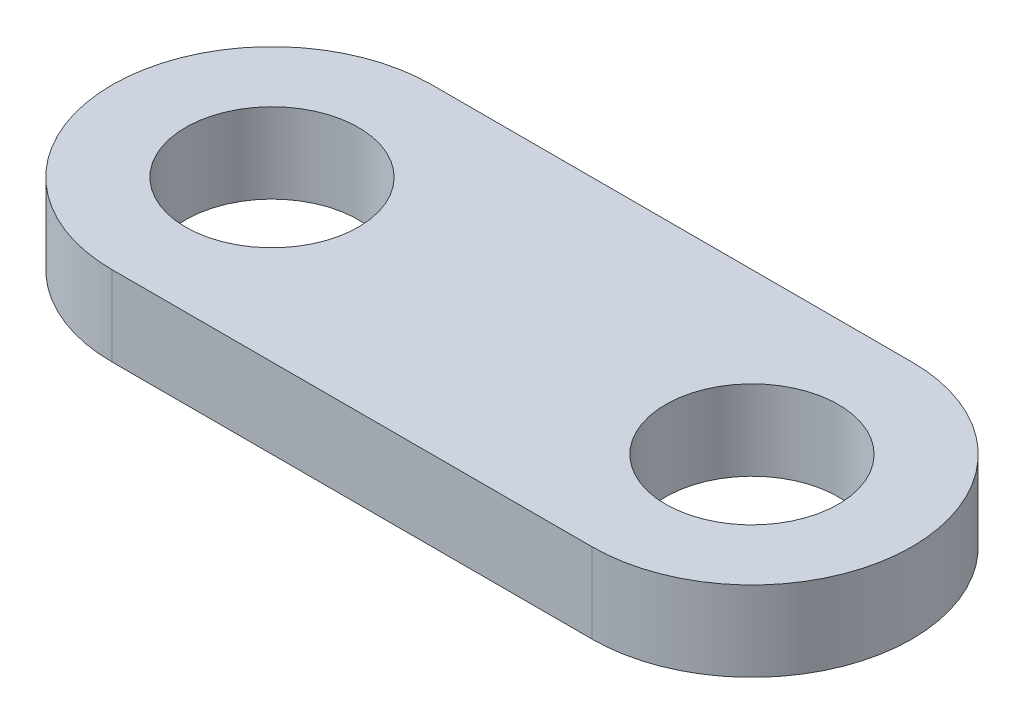
ISO-10303-21;
HEADER;
FILE_DESCRIPTION(('STEP AP214'),'2;1');
FILE_NAME('part.step','',(''),(''),'','','');
FILE_SCHEMA(('AUTOMOTIVE_DESIGN { 1 0 10303 214 1 1 1 1 }'));
ENDSEC;
DATA;
#1=APPLICATION_CONTEXT('core data for automotive mechanical design processes');
#2=APPLICATION_PROTOCOL_DEFINITION('international standard','automotive_design',2000,#1);
#3=PRODUCT_CONTEXT('',#1,'mechanical');
#4=PRODUCT('Part','Part','',(#3));
#5=PRODUCT_RELATED_PRODUCT_CATEGORY('part','',(#4));
#6=PRODUCT_DEFINITION_FORMATION('','',#4);
#7=PRODUCT_DEFINITION_CONTEXT('part definition',#1,'design');
#8=PRODUCT_DEFINITION('design','',#6,#7);
#9=PRODUCT_DEFINITION_SHAPE('','',#8);
#10=(LENGTH_UNIT() NAMED_UNIT(*) SI_UNIT(.MILLI.,.METRE.));
#11=(NAMED_UNIT(*) PLANE_ANGLE_UNIT() SI_UNIT($,.RADIAN.));
#12=(NAMED_UNIT(*) SI_UNIT($,.STERADIAN.) SOLID_ANGLE_UNIT());
#13=UNCERTAINTY_MEASURE_WITH_UNIT(LENGTH_MEASURE(1.E-05),#10,'distance_accuracy_value','');
#14=(GEOMETRIC_REPRESENTATION_CONTEXT(3) GLOBAL_UNCERTAINTY_ASSIGNED_CONTEXT((#13)) GLOBAL_UNIT_ASSIGNED_CONTEXT((#10,
#11,#12)) REPRESENTATION_CONTEXT('',''));
#15=CARTESIAN_POINT('',(0.,0.,0.));
#16=DIRECTION('',(0.,0.,1.));
#17=DIRECTION('',(1.,0.,0.));
#18=AXIS2_PLACEMENT_3D('',#15,#16,#17);
#19=CARTESIAN_POINT('',(-7.5,2.5,0.));
#20=DIRECTION('',(0.,1.,0.));
#21=DIRECTION('',(0.,0.,1.));
#22=AXIS2_PLACEMENT_3D('',#19,#20,#21);
#23=PLANE('',#22);
#24=CARTESIAN_POINT('',(-7.5,2.5,0.));
#25=DIRECTION('',(0.,1.,0.));
#26=DIRECTION('',(0.,0.,1.));
#27=AXIS2_PLACEMENT_3D('',#24,#25,#26);
#28=CIRCLE('',#27,2.7);
#29=CARTESIAN_POINT('',(-7.5,2.5,2.7));
#30=VERTEX_POINT('',#29);
#31=EDGE_CURVE('E106',#30,#30,#28,.T.);
#32=ORIENTED_EDGE('',*,*,#31,.F.);
#33=EDGE_LOOP('',(#32));
#34=FACE_BOUND('',#33,.T.);
#35=CARTESIAN_POINT('',(-7.5,2.5,0.));
#36=DIRECTION('',(0.,1.,0.));
#37=DIRECTION('',(0.,0.,1.));
#38=AXIS2_PLACEMENT_3D('',#35,#36,#37);
#39=CIRCLE('',#38,5.);
#40=CARTESIAN_POINT('',(-7.5,2.5,-5.));
#41=VERTEX_POINT('',#40);
#42=CARTESIAN_POINT('',(-7.5,2.5,5.));
#43=VERTEX_POINT('',#42);
#44=EDGE_CURVE('E91',#41,#43,#39,.T.);
#45=ORIENTED_EDGE('',*,*,#44,.T.);
#46=DIRECTION('',(1.,0.,0.));
#47=VECTOR('',#46,1.);
#48=CARTESIAN_POINT('',(-7.5,2.5,5.));
#49=LINE('',#48,#47);
#50=CARTESIAN_POINT('',(7.5,2.5,5.));
#51=VERTEX_POINT('',#50);
#52=EDGE_CURVE('E86',#43,#51,#49,.T.);
#53=ORIENTED_EDGE('',*,*,#52,.T.);
#54=CARTESIAN_POINT('',(7.5,2.5,0.));
#55=DIRECTION('',(0.,1.,0.));
#56=DIRECTION('',(0.,0.,1.));
#57=AXIS2_PLACEMENT_3D('',#54,#55,#56);
#58=CIRCLE('',#57,5.);
#59=CARTESIAN_POINT('',(7.5,2.5,-5.));
#60=VERTEX_POINT('',#59);
#61=EDGE_CURVE('E89',#51,#60,#58,.T.);
#62=ORIENTED_EDGE('',*,*,#61,.T.);
#63=DIRECTION('',(-1.,0.,0.));
#64=VECTOR('',#63,1.);
#65=CARTESIAN_POINT('',(-7.5,2.5,-5.));
#66=LINE('',#65,#64);
#67=EDGE_CURVE('E56',#60,#41,#66,.T.);
#68=ORIENTED_EDGE('',*,*,#67,.T.);
#69=EDGE_LOOP('',(#45,#53,#62,#68));
#70=FACE_BOUND('',#69,.T.);
#71=CARTESIAN_POINT('',(7.5,2.5,0.));
#72=DIRECTION('',(0.,1.,0.));
#73=DIRECTION('',(0.,0.,1.));
#74=AXIS2_PLACEMENT_3D('',#71,#72,#73);
#75=CIRCLE('',#74,2.7);
#76=CARTESIAN_POINT('',(7.5,2.5,2.7));
#77=VERTEX_POINT('',#76);
#78=EDGE_CURVE('E121',#77,#77,#75,.T.);
#79=ORIENTED_EDGE('',*,*,#78,.F.);
#80=EDGE_LOOP('',(#79));
#81=FACE_BOUND('',#80,.T.);
#82=ADVANCED_FACE('F39',(#34,#70,#81),#23,.T.);
#83=CARTESIAN_POINT('',(-7.5,0.,0.));
#84=DIRECTION('',(0.,1.,0.));
#85=DIRECTION('',(0.,0.,1.));
#86=AXIS2_PLACEMENT_3D('',#83,#84,#85);
#87=PLANE('',#86);
#88=CARTESIAN_POINT('',(-7.5,0.,0.));
#89=DIRECTION('',(0.,1.,0.));
#90=DIRECTION('',(0.,0.,1.));
#91=AXIS2_PLACEMENT_3D('',#88,#89,#90);
#92=CIRCLE('',#91,5.);
#93=CARTESIAN_POINT('',(-7.5,0.,-5.));
#94=VERTEX_POINT('',#93);
#95=CARTESIAN_POINT('',(-7.5,0.,5.));
#96=VERTEX_POINT('',#95);
#97=EDGE_CURVE('E103',#94,#96,#92,.T.);
#98=ORIENTED_EDGE('',*,*,#97,.F.);
#99=DIRECTION('',(-1.,0.,0.));
#100=VECTOR('',#99,1.);
#101=CARTESIAN_POINT('',(-7.5,0.,-5.));
#102=LINE('',#101,#100);
#103=CARTESIAN_POINT('',(7.5,0.,-5.));
#104=VERTEX_POINT('',#103);
#105=EDGE_CURVE('E79',#104,#94,#102,.T.);
#106=ORIENTED_EDGE('',*,*,#105,.F.);
#107=CARTESIAN_POINT('',(7.5,0.,0.));
#108=DIRECTION('',(0.,1.,0.));
#109=DIRECTION('',(0.,0.,1.));
#110=AXIS2_PLACEMENT_3D('',#107,#108,#109);
#111=CIRCLE('',#110,5.);
#112=CARTESIAN_POINT('',(7.5,0.,5.));
#113=VERTEX_POINT('',#112);
#114=EDGE_CURVE('E73',#113,#104,#111,.T.);
#115=ORIENTED_EDGE('',*,*,#114,.F.);
#116=DIRECTION('',(1.,0.,0.));
#117=VECTOR('',#116,1.);
#118=CARTESIAN_POINT('',(-7.5,0.,5.));
#119=LINE('',#118,#117);
#120=EDGE_CURVE('E95',#96,#113,#119,.T.);
#121=ORIENTED_EDGE('',*,*,#120,.F.);
#122=EDGE_LOOP('',(#98,#106,#115,#121));
#123=FACE_BOUND('',#122,.T.);
#124=CARTESIAN_POINT('',(-7.5,0.,0.));
#125=DIRECTION('',(0.,1.,0.));
#126=DIRECTION('',(0.,0.,1.));
#127=AXIS2_PLACEMENT_3D('',#124,#125,#126);
#128=CIRCLE('',#127,2.7);
#129=CARTESIAN_POINT('',(-7.5,0.,2.7));
#130=VERTEX_POINT('',#129);
#131=EDGE_CURVE('E118',#130,#130,#128,.T.);
#132=ORIENTED_EDGE('',*,*,#131,.T.);
#133=EDGE_LOOP('',(#132));
#134=FACE_BOUND('',#133,.T.);
#135=CARTESIAN_POINT('',(7.5,0.,0.));
#136=DIRECTION('',(0.,1.,0.));
#137=DIRECTION('',(0.,0.,1.));
#138=AXIS2_PLACEMENT_3D('',#135,#136,#137);
#139=CIRCLE('',#138,2.7);
#140=CARTESIAN_POINT('',(7.5,0.,2.7));
#141=VERTEX_POINT('',#140);
#142=EDGE_CURVE('E124',#141,#141,#139,.T.);
#143=ORIENTED_EDGE('',*,*,#142,.T.);
#144=EDGE_LOOP('',(#143));
#145=FACE_BOUND('',#144,.T.);
#146=ADVANCED_FACE('F114',(#123,#134,#145),#87,.F.);
#147=CARTESIAN_POINT('',(-7.5,2.5,0.));
#148=DIRECTION('',(0.,-1.,0.));
#149=DIRECTION('',(0.,0.,-1.));
#150=AXIS2_PLACEMENT_3D('',#147,#148,#149);
#151=CYLINDRICAL_SURFACE('',#150,5.);
#152=ORIENTED_EDGE('',*,*,#97,.T.);
#153=DIRECTION('',(0.,-1.,0.));
#154=VECTOR('',#153,1.);
#155=CARTESIAN_POINT('',(-7.5,2.5,5.));
#156=LINE('',#155,#154);
#157=EDGE_CURVE('E11',#43,#96,#156,.T.);
#158=ORIENTED_EDGE('',*,*,#157,.F.);
#159=ORIENTED_EDGE('',*,*,#44,.F.);
#160=DIRECTION('',(0.,-1.,0.));
#161=VECTOR('',#160,1.);
#162=CARTESIAN_POINT('',(-7.5,2.5,-5.));
#163=LINE('',#162,#161);
#164=EDGE_CURVE('E99',#41,#94,#163,.T.);
#165=ORIENTED_EDGE('',*,*,#164,.T.);
#166=EDGE_LOOP('',(#152,#158,#159,#165));
#167=FACE_BOUND('',#166,.T.);
#168=ADVANCED_FACE('F41',(#167),#151,.T.);
#169=CARTESIAN_POINT('',(-7.5,2.5,5.));
#170=DIRECTION('',(0.,0.,-1.));
#171=DIRECTION('',(-1.,0.,0.));
#172=AXIS2_PLACEMENT_3D('',#169,#170,#171);
#173=PLANE('',#172);
#174=ORIENTED_EDGE('',*,*,#120,.T.);
#175=DIRECTION('',(0.,-1.,0.));
#176=VECTOR('',#175,1.);
#177=CARTESIAN_POINT('',(7.5,2.5,5.));
#178=LINE('',#177,#176);
#179=EDGE_CURVE('E48',#51,#113,#178,.T.);
#180=ORIENTED_EDGE('',*,*,#179,.F.);
#181=ORIENTED_EDGE('',*,*,#52,.F.);
#182=ORIENTED_EDGE('',*,*,#157,.T.);
#183=EDGE_LOOP('',(#174,#180,#181,#182));
#184=FACE_BOUND('',#183,.T.);
#185=ADVANCED_FACE('F94',(#184),#173,.F.);
#186=CARTESIAN_POINT('',(7.5,2.5,0.));
#187=DIRECTION('',(0.,-1.,0.));
#188=DIRECTION('',(0.,0.,-1.));
#189=AXIS2_PLACEMENT_3D('',#186,#187,#188);
#190=CYLINDRICAL_SURFACE('',#189,5.);
#191=ORIENTED_EDGE('',*,*,#114,.T.);
#192=DIRECTION('',(0.,-1.,0.));
#193=VECTOR('',#192,1.);
#194=CARTESIAN_POINT('',(7.5,2.5,-5.));
#195=LINE('',#194,#193);
#196=EDGE_CURVE('E96',#60,#104,#195,.T.);
#197=ORIENTED_EDGE('',*,*,#196,.F.);
#198=ORIENTED_EDGE('',*,*,#61,.F.);
#199=ORIENTED_EDGE('',*,*,#179,.T.);
#200=EDGE_LOOP('',(#191,#197,#198,#199));
#201=FACE_BOUND('',#200,.T.);
#202=ADVANCED_FACE('F97',(#201),#190,.T.);
#203=CARTESIAN_POINT('',(-7.5,2.5,-5.));
#204=DIRECTION('',(0.,0.,1.));
#205=DIRECTION('',(1.,0.,0.));
#206=AXIS2_PLACEMENT_3D('',#203,#204,#205);
#207=PLANE('',#206);
#208=ORIENTED_EDGE('',*,*,#105,.T.);
#209=ORIENTED_EDGE('',*,*,#164,.F.);
#210=ORIENTED_EDGE('',*,*,#67,.F.);
#211=ORIENTED_EDGE('',*,*,#196,.T.);
#212=EDGE_LOOP('',(#208,#209,#210,#211));
#213=FACE_BOUND('',#212,.T.);
#214=ADVANCED_FACE('F111',(#213),#207,.F.);
#215=CARTESIAN_POINT('',(-7.5,2.5,0.));
#216=DIRECTION('',(0.,-1.,0.));
#217=DIRECTION('',(0.,0.,-1.));
#218=AXIS2_PLACEMENT_3D('',#215,#216,#217);
#219=CYLINDRICAL_SURFACE('',#218,2.7);
#220=ORIENTED_EDGE('',*,*,#31,.T.);
#221=EDGE_LOOP('',(#220));
#222=FACE_BOUND('',#221,.T.);
#223=ORIENTED_EDGE('',*,*,#131,.F.);
#224=EDGE_LOOP('',(#223));
#225=FACE_BOUND('',#224,.T.);
#226=ADVANCED_FACE('F141',(#222,#225),#219,.F.);
#227=CARTESIAN_POINT('',(7.5,2.5,0.));
#228=DIRECTION('',(0.,-1.,0.));
#229=DIRECTION('',(0.,0.,-1.));
#230=AXIS2_PLACEMENT_3D('',#227,#228,#229);
#231=CYLINDRICAL_SURFACE('',#230,2.7);
#232=ORIENTED_EDGE('',*,*,#78,.T.);
#233=EDGE_LOOP('',(#232));
#234=FACE_BOUND('',#233,.T.);
#235=ORIENTED_EDGE('',*,*,#142,.F.);
#236=EDGE_LOOP('',(#235));
#237=FACE_BOUND('',#236,.T.);
#238=ADVANCED_FACE('F130',(#234,#237),#231,.F.);
#239=CLOSED_SHELL('',(#82,#146,#168,#185,#202,#214,#226,#238));
#240=MANIFOLD_SOLID_BREP('B2',#239);
#241=ADVANCED_BREP_SHAPE_REPRESENTATION('',(#18,#240),#14);
#242=SHAPE_DEFINITION_REPRESENTATION(#9,#241);
ENDSEC;
END-ISO-10303-21;
